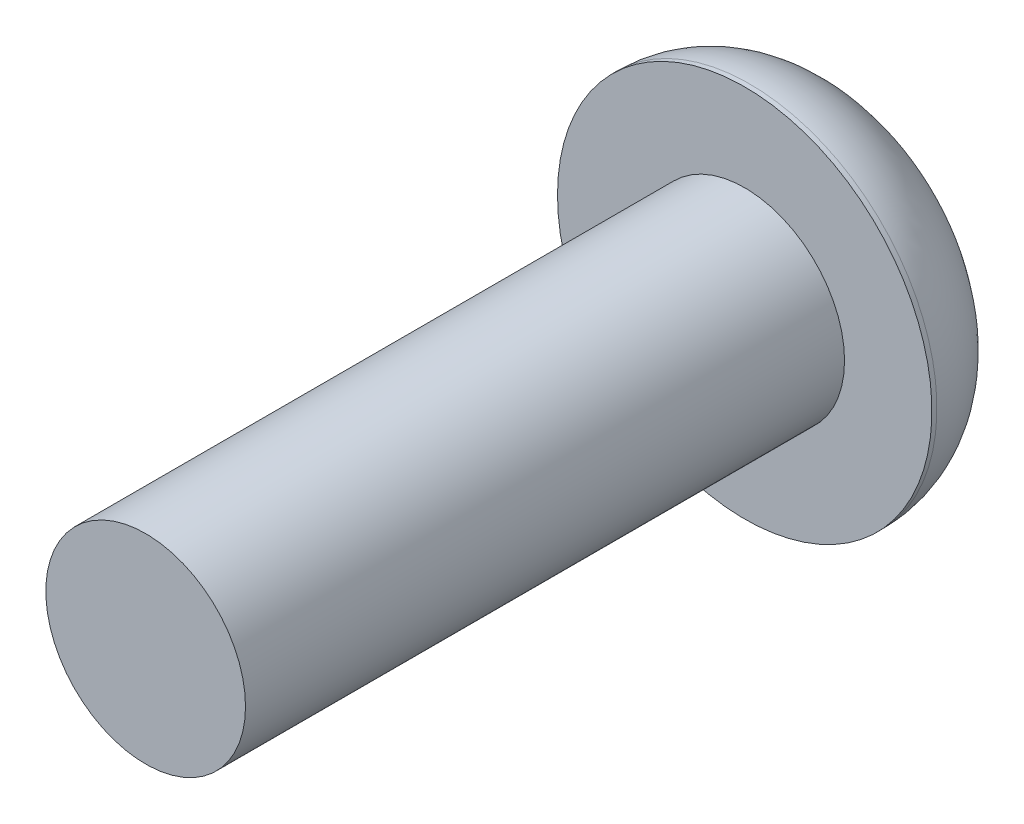
ISO-10303-21;
HEADER;
FILE_DESCRIPTION(('STEP AP214'),'2;1');
FILE_NAME('part.step','',(''),(''),'','','');
FILE_SCHEMA(('AUTOMOTIVE_DESIGN { 1 0 10303 214 1 1 1 1 }'));
ENDSEC;
DATA;
#1=APPLICATION_CONTEXT('core data for automotive mechanical design processes');
#2=APPLICATION_PROTOCOL_DEFINITION('international standard','automotive_design',2000,#1);
#3=PRODUCT_CONTEXT('',#1,'mechanical');
#4=PRODUCT('Part','Part','',(#3));
#5=PRODUCT_RELATED_PRODUCT_CATEGORY('part','',(#4));
#6=PRODUCT_DEFINITION_FORMATION('','',#4);
#7=PRODUCT_DEFINITION_CONTEXT('part definition',#1,'design');
#8=PRODUCT_DEFINITION('design','',#6,#7);
#9=PRODUCT_DEFINITION_SHAPE('','',#8);
#10=(LENGTH_UNIT() NAMED_UNIT(*) SI_UNIT(.MILLI.,.METRE.));
#11=(NAMED_UNIT(*) PLANE_ANGLE_UNIT() SI_UNIT($,.RADIAN.));
#12=(NAMED_UNIT(*) SI_UNIT($,.STERADIAN.) SOLID_ANGLE_UNIT());
#13=UNCERTAINTY_MEASURE_WITH_UNIT(LENGTH_MEASURE(1.E-05),#10,'distance_accuracy_value','');
#14=(GEOMETRIC_REPRESENTATION_CONTEXT(3) GLOBAL_UNCERTAINTY_ASSIGNED_CONTEXT((#13)) GLOBAL_UNIT_ASSIGNED_CONTEXT((#10,
#11,#12)) REPRESENTATION_CONTEXT('',''));
#15=CARTESIAN_POINT('',(0.,0.,0.));
#16=DIRECTION('',(0.,0.,1.));
#17=DIRECTION('',(1.,0.,0.));
#18=AXIS2_PLACEMENT_3D('',#15,#16,#17);
#19=CARTESIAN_POINT('',(0.,0.,12.));
#20=DIRECTION('',(0.,0.,-1.));
#21=DIRECTION('',(-1.,0.,0.));
#22=AXIS2_PLACEMENT_3D('',#19,#20,#21);
#23=CYLINDRICAL_SURFACE('',#22,2.);
#24=CARTESIAN_POINT('',(0.,0.,12.));
#25=DIRECTION('',(0.,0.,1.));
#26=DIRECTION('',(1.,0.,0.));
#27=AXIS2_PLACEMENT_3D('',#24,#25,#26);
#28=CIRCLE('',#27,2.);
#29=CARTESIAN_POINT('',(2.,0.,12.));
#30=VERTEX_POINT('',#29);
#31=EDGE_CURVE('E50',#30,#30,#28,.T.);
#32=ORIENTED_EDGE('',*,*,#31,.F.);
#33=EDGE_LOOP('',(#32));
#34=FACE_BOUND('',#33,.T.);
#35=CARTESIAN_POINT('',(0.,0.,0.));
#36=DIRECTION('',(0.,0.,1.));
#37=DIRECTION('',(1.,0.,0.));
#38=AXIS2_PLACEMENT_3D('',#35,#36,#37);
#39=CIRCLE('',#38,2.);
#40=CARTESIAN_POINT('',(2.,0.,0.));
#41=VERTEX_POINT('',#40);
#42=EDGE_CURVE('E55',#41,#41,#39,.T.);
#43=ORIENTED_EDGE('',*,*,#42,.T.);
#44=EDGE_LOOP('',(#43));
#45=FACE_BOUND('',#44,.T.);
#46=ADVANCED_FACE('F37',(#34,#45),#23,.T.);
#47=CARTESIAN_POINT('',(0.,0.,12.));
#48=DIRECTION('',(0.,0.,1.));
#49=DIRECTION('',(1.,0.,0.));
#50=AXIS2_PLACEMENT_3D('',#47,#48,#49);
#51=PLANE('',#50);
#52=ORIENTED_EDGE('',*,*,#31,.T.);
#53=EDGE_LOOP('',(#52));
#54=FACE_BOUND('',#53,.T.);
#55=ADVANCED_FACE('F82',(#54),#51,.T.);
#56=CARTESIAN_POINT('',(0.,0.,-2.1));
#57=DIRECTION('',(0.,0.,1.));
#58=DIRECTION('',(1.,0.,0.));
#59=AXIS2_PLACEMENT_3D('',#56,#57,#58);
#60=CYLINDRICAL_SURFACE('',#59,3.75);
#61=CARTESIAN_POINT('',(0.,0.,-0.1));
#62=DIRECTION('',(0.,0.,-1.));
#63=DIRECTION('',(-1.,0.,0.));
#64=AXIS2_PLACEMENT_3D('',#61,#62,#63);
#65=CIRCLE('',#64,3.75);
#66=CARTESIAN_POINT('',(-3.75,0.,-0.1));
#67=VERTEX_POINT('',#66);
#68=EDGE_CURVE('E10',#67,#67,#65,.F.);
#69=ORIENTED_EDGE('',*,*,#68,.T.);
#70=EDGE_LOOP('',(#69));
#71=FACE_BOUND('',#70,.T.);
#72=CARTESIAN_POINT('',(0.,0.,0.));
#73=DIRECTION('',(0.,0.,-1.));
#74=DIRECTION('',(-1.,0.,0.));
#75=AXIS2_PLACEMENT_3D('',#72,#73,#74);
#76=CIRCLE('',#75,3.75);
#77=CARTESIAN_POINT('',(-3.75,0.,0.));
#78=VERTEX_POINT('',#77);
#79=EDGE_CURVE('E60',#78,#78,#76,.T.);
#80=ORIENTED_EDGE('',*,*,#79,.T.);
#81=EDGE_LOOP('',(#80));
#82=FACE_BOUND('',#81,.T.);
#83=ADVANCED_FACE('F66',(#71,#82),#60,.T.);
#84=CARTESIAN_POINT('',(0.,0.,-2.1));
#85=DIRECTION('',(0.,0.,-1.));
#86=DIRECTION('',(-1.,0.,0.));
#87=AXIS2_PLACEMENT_3D('',#84,#85,#86);
#88=PLANE('',#87);
#89=CARTESIAN_POINT('',(0.,0.,-2.1));
#90=DIRECTION('',(0.,0.,-1.));
#91=DIRECTION('',(-1.,0.,0.));
#92=AXIS2_PLACEMENT_3D('',#89,#90,#91);
#93=CIRCLE('',#92,1.75);
#94=CARTESIAN_POINT('',(-1.75,0.,-2.1));
#95=VERTEX_POINT('',#94);
#96=EDGE_CURVE('E45',#95,#95,#93,.T.);
#97=ORIENTED_EDGE('',*,*,#96,.T.);
#98=EDGE_LOOP('',(#97));
#99=FACE_BOUND('',#98,.T.);
#100=ADVANCED_FACE('F70',(#99),#88,.T.);
#101=CARTESIAN_POINT('',(0.,0.,0.));
#102=DIRECTION('',(0.,0.,-1.));
#103=DIRECTION('',(-1.,0.,0.));
#104=AXIS2_PLACEMENT_3D('',#101,#102,#103);
#105=PLANE('',#104);
#106=ORIENTED_EDGE('',*,*,#42,.F.);
#107=EDGE_LOOP('',(#106));
#108=FACE_BOUND('',#107,.T.);
#109=ORIENTED_EDGE('',*,*,#79,.F.);
#110=EDGE_LOOP('',(#109));
#111=FACE_BOUND('',#110,.T.);
#112=ADVANCED_FACE('F68',(#108,#111),#105,.F.);
#113=CARTESIAN_POINT('',(0.,0.,-0.1));
#114=DIRECTION('',(0.,0.,-1.));
#115=DIRECTION('',(-1.,0.,0.));
#116=AXIS2_PLACEMENT_3D('',#113,#114,#115);
#117=DEGENERATE_TOROIDAL_SURFACE('',#116,1.75,2.,.T.);
#118=ORIENTED_EDGE('',*,*,#68,.F.);
#119=EDGE_LOOP('',(#118));
#120=FACE_BOUND('',#119,.T.);
#121=ORIENTED_EDGE('',*,*,#96,.F.);
#122=EDGE_LOOP('',(#121));
#123=FACE_BOUND('',#122,.T.);
#124=ADVANCED_FACE('F39',(#120,#123),#117,.T.);
#125=CLOSED_SHELL('',(#46,#55,#83,#100,#112,#124));
#126=MANIFOLD_SOLID_BREP('B2',#125);
#127=ADVANCED_BREP_SHAPE_REPRESENTATION('',(#18,#126),#14);
#128=SHAPE_DEFINITION_REPRESENTATION(#9,#127);
ENDSEC;
END-ISO-10303-21;
